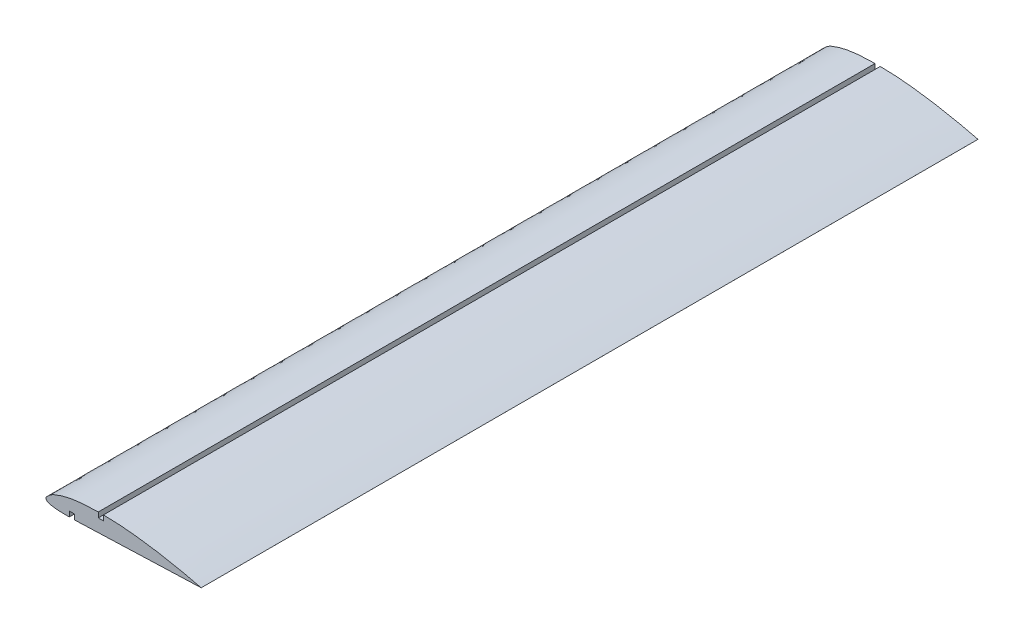
ISO-10303-21;
HEADER;
FILE_DESCRIPTION(('STEP AP214'),'2;1');
FILE_NAME('part.step','',(''),(''),'','','');
FILE_SCHEMA(('AUTOMOTIVE_DESIGN { 1 0 10303 214 1 1 1 1 }'));
ENDSEC;
DATA;
#1=APPLICATION_CONTEXT('core data for automotive mechanical design processes');
#2=APPLICATION_PROTOCOL_DEFINITION('international standard','automotive_design',2000,#1);
#3=PRODUCT_CONTEXT('',#1,'mechanical');
#4=PRODUCT('Part','Part','',(#3));
#5=PRODUCT_RELATED_PRODUCT_CATEGORY('part','',(#4));
#6=PRODUCT_DEFINITION_FORMATION('','',#4);
#7=PRODUCT_DEFINITION_CONTEXT('part definition',#1,'design');
#8=PRODUCT_DEFINITION('design','',#6,#7);
#9=PRODUCT_DEFINITION_SHAPE('','',#8);
#10=(LENGTH_UNIT() NAMED_UNIT(*) SI_UNIT(.MILLI.,.METRE.));
#11=(NAMED_UNIT(*) PLANE_ANGLE_UNIT() SI_UNIT($,.RADIAN.));
#12=(NAMED_UNIT(*) SI_UNIT($,.STERADIAN.) SOLID_ANGLE_UNIT());
#13=UNCERTAINTY_MEASURE_WITH_UNIT(LENGTH_MEASURE(1.E-05),#10,'distance_accuracy_value','');
#14=(GEOMETRIC_REPRESENTATION_CONTEXT(3) GLOBAL_UNCERTAINTY_ASSIGNED_CONTEXT((#13)) GLOBAL_UNIT_ASSIGNED_CONTEXT((#10,
#11,#12)) REPRESENTATION_CONTEXT('',''));
#15=CARTESIAN_POINT('',(0.,0.,0.));
#16=DIRECTION('',(0.,0.,1.));
#17=DIRECTION('',(1.,0.,0.));
#18=AXIS2_PLACEMENT_3D('',#15,#16,#17);
#19=CARTESIAN_POINT('',(149.858113324451,0.,750.));
#20=CARTESIAN_POINT('',(148.064864637399,0.471027480571199,750.));
#21=CARTESIAN_POINT('',(143.224769961219,1.74236211811161,750.));
#22=CARTESIAN_POINT('',(133.17567091378,3.88603462709681,750.));
#23=CARTESIAN_POINT('',(119.49949698937,6.75825321488289,750.));
#24=CARTESIAN_POINT('',(102.541429981933,9.74443836476265,750.));
#25=CARTESIAN_POINT('',(85.9645177190842,11.9562687917025,750.));
#26=CARTESIAN_POINT('',(70.8168434684203,13.3137751379511,750.));
#27=CARTESIAN_POINT('',(56.6678267857071,13.848112215604,750.));
#28=CARTESIAN_POINT('',(41.7647448709352,13.6427323871967,750.));
#29=CARTESIAN_POINT('',(27.8783013676399,12.538757837371,750.));
#30=CARTESIAN_POINT('',(17.5168627272865,10.350224421098,750.));
#31=CARTESIAN_POINT('',(10.936048165934,8.12119196566078,750.));
#32=CARTESIAN_POINT('',(5.62820626621041,6.01727904599079,750.));
#33=CARTESIAN_POINT('',(2.24075913813908,3.15994777527147,750.));
#34=CARTESIAN_POINT('',(-0.29369692166815,0.719700584099168,750.));
#35=CARTESIAN_POINT('',(0.542306534655351,-2.40076311543508,750.));
#36=CARTESIAN_POINT('',(4.95662502281578,-3.53766337211111,750.));
#37=CARTESIAN_POINT('',(10.612229446523,-4.32782494228123,750.));
#38=CARTESIAN_POINT('',(18.7708181091969,-4.49819941068066,750.));
#39=CARTESIAN_POINT('',(30.5005368269184,-4.49335985929626,750.));
#40=CARTESIAN_POINT('',(45.7844665479909,-3.91223480346035,750.));
#41=CARTESIAN_POINT('',(66.3707609860383,-3.12279025641842,750.));
#42=CARTESIAN_POINT('',(87.01625275022,-2.37810206356992,750.));
#43=CARTESIAN_POINT('',(108.487999192868,-1.57615015565665,750.));
#44=CARTESIAN_POINT('',(124.547177915777,-1.00276144849991,750.));
#45=CARTESIAN_POINT('',(137.784916861577,-0.52187684905939,750.));
#46=CARTESIAN_POINT('',(145.12231888116,-0.266429975668519,750.));
#47=CARTESIAN_POINT('',(148.916898874476,-0.0599947981625784,750.));
#48=CARTESIAN_POINT('',(149.855835651228,-0.00867132956302672,750.));
#49=B_SPLINE_CURVE_WITH_KNOTS('',3,(#19,#20,#21,#22,#23,#24,#25,#26,#27,#28,#29,#30,#31,#32,#33,
#34,#35,#36,#37,#38,#39,#40,#41,#42,#43,#44,#45,#46,#47,#48),.UNSPECIFIED.,.F.,.F.,(4,1,1,1,1,1,
1,1,1,1,1,1,1,1,1,1,1,1,1,1,1,1,1,1,1,1,1,4),(0.,0.0181631382577917,0.0490234920135145,
0.10064364459373,0.155079572876184,0.217678278972855,0.264435783533979,0.304025297713347,
0.35634535608504,0.410393024717116,0.440307190464658,0.459595640947688,0.478843318113965,
0.494821297559263,0.504998977671131,0.508601055765118,0.52425623472622,0.542615556539684,
0.567476747028401,0.602874088847224,0.658123072245803,0.717036036237965,0.804816302326953,
0.860486782816155,0.927555311002133,0.962250042652268,0.990268591499163,0.999481251844763),.UNSPECIFIED.);
#50=DIRECTION('',(0.,0.,-1.));
#51=VECTOR('',#50,1.);
#52=SURFACE_OF_LINEAR_EXTRUSION('',#49,#51);
#53=CARTESIAN_POINT('',(27.5042715696321,-4.45472738450817,750.));
#54=VERTEX_POINT('',#53);
#55=CARTESIAN_POINT('',(149.855835651228,-0.00867132956302675,750.));
#56=VERTEX_POINT('',#55);
#57=EDGE_CURVE('E179',#54,#56,#49,.T.);
#58=ORIENTED_EDGE('',*,*,#57,.F.);
#59=DIRECTION('',(0.,0.,-1.));
#60=VECTOR('',#59,1.);
#61=CARTESIAN_POINT('',(27.5042715696321,-4.45472738450817,750.));
#62=LINE('',#61,#60);
#63=CARTESIAN_POINT('',(27.5042715696321,-4.45472738450817,0.));
#64=VERTEX_POINT('',#63);
#65=EDGE_CURVE('E168',#54,#64,#62,.T.);
#66=ORIENTED_EDGE('',*,*,#65,.T.);
#67=CARTESIAN_POINT('',(149.858113324451,0.,0.));
#68=CARTESIAN_POINT('',(148.064864637399,0.471027480571199,0.));
#69=CARTESIAN_POINT('',(143.224769961219,1.74236211811161,0.));
#70=CARTESIAN_POINT('',(133.17567091378,3.88603462709681,0.));
#71=CARTESIAN_POINT('',(119.49949698937,6.75825321488289,0.));
#72=CARTESIAN_POINT('',(102.541429981933,9.74443836476265,0.));
#73=CARTESIAN_POINT('',(85.9645177190842,11.9562687917025,0.));
#74=CARTESIAN_POINT('',(70.8168434684203,13.3137751379511,0.));
#75=CARTESIAN_POINT('',(56.6678267857071,13.848112215604,0.));
#76=CARTESIAN_POINT('',(41.7647448709352,13.6427323871967,0.));
#77=CARTESIAN_POINT('',(27.8783013676399,12.538757837371,0.));
#78=CARTESIAN_POINT('',(17.5168627272865,10.350224421098,0.));
#79=CARTESIAN_POINT('',(10.936048165934,8.12119196566078,0.));
#80=CARTESIAN_POINT('',(5.62820626621041,6.01727904599079,0.));
#81=CARTESIAN_POINT('',(2.24075913813908,3.15994777527147,0.));
#82=CARTESIAN_POINT('',(-0.29369692166815,0.719700584099168,0.));
#83=CARTESIAN_POINT('',(0.542306534655351,-2.40076311543508,0.));
#84=CARTESIAN_POINT('',(4.95662502281578,-3.53766337211111,0.));
#85=CARTESIAN_POINT('',(10.612229446523,-4.32782494228123,0.));
#86=CARTESIAN_POINT('',(18.7708181091969,-4.49819941068066,0.));
#87=CARTESIAN_POINT('',(30.5005368269184,-4.49335985929626,0.));
#88=CARTESIAN_POINT('',(45.7844665479909,-3.91223480346035,0.));
#89=CARTESIAN_POINT('',(66.3707609860383,-3.12279025641842,0.));
#90=CARTESIAN_POINT('',(87.01625275022,-2.37810206356992,0.));
#91=CARTESIAN_POINT('',(108.487999192868,-1.57615015565665,0.));
#92=CARTESIAN_POINT('',(124.547177915777,-1.00276144849991,0.));
#93=CARTESIAN_POINT('',(137.784916861577,-0.52187684905939,0.));
#94=CARTESIAN_POINT('',(145.12231888116,-0.266429975668519,0.));
#95=CARTESIAN_POINT('',(148.916898874476,-0.0599947981625784,0.));
#96=CARTESIAN_POINT('',(149.855835651228,-0.00867132956302672,0.));
#97=B_SPLINE_CURVE_WITH_KNOTS('',3,(#67,#68,#69,#70,#71,#72,#73,#74,#75,#76,#77,#78,#79,#80,#81,
#82,#83,#84,#85,#86,#87,#88,#89,#90,#91,#92,#93,#94,#95,#96),.UNSPECIFIED.,.F.,.F.,(4,1,1,1,1,1,
1,1,1,1,1,1,1,1,1,1,1,1,1,1,1,1,1,1,1,1,1,4),(0.,0.0181631382577917,0.0490234920135145,
0.10064364459373,0.155079572876184,0.217678278972855,0.264435783533979,0.304025297713347,
0.35634535608504,0.410393024717116,0.440307190464658,0.459595640947688,0.478843318113965,
0.494821297559263,0.504998977671131,0.508601055765118,0.52425623472622,0.542615556539684,
0.567476747028401,0.602874088847224,0.658123072245803,0.717036036237965,0.804816302326953,
0.860486782816155,0.927555311002133,0.962250042652268,0.990268591499163,0.999481251844763),.UNSPECIFIED.);
#98=CARTESIAN_POINT('',(149.855835651228,-0.00867132956302675,0.));
#99=VERTEX_POINT('',#98);
#100=EDGE_CURVE('E170',#64,#99,#97,.T.);
#101=ORIENTED_EDGE('',*,*,#100,.T.);
#102=DIRECTION('',(0.,0.,-1.));
#103=VECTOR('',#102,1.);
#104=CARTESIAN_POINT('',(149.855835651228,-0.00867132956302675,750.));
#105=LINE('',#104,#103);
#106=EDGE_CURVE('E198',#56,#99,#105,.T.);
#107=ORIENTED_EDGE('',*,*,#106,.F.);
#108=EDGE_LOOP('',(#58,#66,#101,#107));
#109=FACE_BOUND('',#108,.T.);
#110=ADVANCED_FACE('F38',(#109),#52,.F.);
#111=CARTESIAN_POINT('',(50.4738305818708,13.7214936596193,0.));
#112=VERTEX_POINT('',#111);
#113=CARTESIAN_POINT('',(22.504271550368,-4.48413350364602,0.));
#114=VERTEX_POINT('',#113);
#115=EDGE_CURVE('E191',#112,#114,#97,.T.);
#116=ORIENTED_EDGE('',*,*,#115,.T.);
#117=DIRECTION('',(0.,0.,-1.));
#118=VECTOR('',#117,1.);
#119=CARTESIAN_POINT('',(22.5042715696321,-4.48413350365689,750.));
#120=LINE('',#119,#118);
#121=CARTESIAN_POINT('',(22.5042715696321,-4.48413350364602,750.));
#122=VERTEX_POINT('',#121);
#123=EDGE_CURVE('E53',#114,#122,#120,.F.);
#124=ORIENTED_EDGE('',*,*,#123,.T.);
#125=CARTESIAN_POINT('',(50.4738305818708,13.7214936596193,750.));
#126=VERTEX_POINT('',#125);
#127=EDGE_CURVE('E178',#126,#122,#49,.T.);
#128=ORIENTED_EDGE('',*,*,#127,.F.);
#129=DIRECTION('',(0.,0.,-1.));
#130=VECTOR('',#129,1.);
#131=CARTESIAN_POINT('',(50.4738305818708,13.7214936596193,750.));
#132=LINE('',#131,#130);
#133=EDGE_CURVE('E158',#126,#112,#132,.T.);
#134=ORIENTED_EDGE('',*,*,#133,.T.);
#135=EDGE_LOOP('',(#116,#124,#128,#134));
#136=FACE_BOUND('',#135,.T.);
#137=ADVANCED_FACE('F223',(#136),#52,.F.);
#138=CARTESIAN_POINT('',(149.858113324451,0.,0.));
#139=VERTEX_POINT('',#138);
#140=CARTESIAN_POINT('',(55.4738305818709,13.7366739658769,0.));
#141=VERTEX_POINT('',#140);
#142=EDGE_CURVE('E185',#139,#141,#97,.T.);
#143=ORIENTED_EDGE('',*,*,#142,.T.);
#144=DIRECTION('',(0.,0.,-1.));
#145=VECTOR('',#144,1.);
#146=CARTESIAN_POINT('',(55.4738305818708,13.7366739658769,750.));
#147=LINE('',#146,#145);
#148=CARTESIAN_POINT('',(55.4738305818708,13.7366739658769,750.));
#149=VERTEX_POINT('',#148);
#150=EDGE_CURVE('E61',#141,#149,#147,.F.);
#151=ORIENTED_EDGE('',*,*,#150,.T.);
#152=CARTESIAN_POINT('',(149.858113324451,0.,750.));
#153=VERTEX_POINT('',#152);
#154=EDGE_CURVE('E171',#153,#149,#49,.T.);
#155=ORIENTED_EDGE('',*,*,#154,.F.);
#156=DIRECTION('',(0.,0.,-1.));
#157=VECTOR('',#156,1.);
#158=CARTESIAN_POINT('',(149.858113324451,0.,750.));
#159=LINE('',#158,#157);
#160=EDGE_CURVE('E184',#153,#139,#159,.T.);
#161=ORIENTED_EDGE('',*,*,#160,.T.);
#162=EDGE_LOOP('',(#143,#151,#155,#161));
#163=FACE_BOUND('',#162,.T.);
#164=ADVANCED_FACE('F40',(#163),#52,.F.);
#165=CARTESIAN_POINT('',(149.858113324451,0.,750.));
#166=DIRECTION('',(-0.967191257388956,0.254049348809183,0.));
#167=DIRECTION('',(-0.254049348809183,-0.967191257388956,0.));
#168=AXIS2_PLACEMENT_3D('',#165,#166,#167);
#169=PLANE('',#168);
#170=DIRECTION('',(0.254049348809183,0.967191257388956,0.));
#171=VECTOR('',#170,1.);
#172=CARTESIAN_POINT('',(149.858113324451,0.,0.));
#173=LINE('',#172,#171);
#174=EDGE_CURVE('E190',#99,#139,#173,.T.);
#175=ORIENTED_EDGE('',*,*,#174,.T.);
#176=ORIENTED_EDGE('',*,*,#160,.F.);
#177=DIRECTION('',(0.254049348809183,0.967191257388956,0.));
#178=VECTOR('',#177,1.);
#179=CARTESIAN_POINT('',(149.858113324451,0.,750.));
#180=LINE('',#179,#178);
#181=EDGE_CURVE('E177',#56,#153,#180,.T.);
#182=ORIENTED_EDGE('',*,*,#181,.F.);
#183=ORIENTED_EDGE('',*,*,#106,.T.);
#184=EDGE_LOOP('',(#175,#176,#182,#183));
#185=FACE_BOUND('',#184,.T.);
#186=ADVANCED_FACE('F219',(#185),#169,.F.);
#187=CARTESIAN_POINT('',(0.580452880039153,1.44329470279021,750.));
#188=DIRECTION('',(0.,0.,-1.));
#189=DIRECTION('',(-1.,0.,0.));
#190=AXIS2_PLACEMENT_3D('',#187,#188,#189);
#191=PLANE('',#190);
#192=DIRECTION('',(1.,0.,0.));
#193=VECTOR('',#192,1.);
#194=CARTESIAN_POINT('',(0.580452880039153,0.545272615491838,750.));
#195=LINE('',#194,#193);
#196=CARTESIAN_POINT('',(22.5042715696321,0.545272615491835,750.));
#197=VERTEX_POINT('',#196);
#198=CARTESIAN_POINT('',(27.5042715696321,0.545272615491835,750.));
#199=VERTEX_POINT('',#198);
#200=EDGE_CURVE('E124',#197,#199,#195,.T.);
#201=ORIENTED_EDGE('',*,*,#200,.T.);
#202=DIRECTION('',(0.,-1.,0.));
#203=VECTOR('',#202,1.);
#204=CARTESIAN_POINT('',(27.5042715696321,1.44329470279021,750.));
#205=LINE('',#204,#203);
#206=EDGE_CURVE('E165',#199,#54,#205,.T.);
#207=ORIENTED_EDGE('',*,*,#206,.T.);
#208=ORIENTED_EDGE('',*,*,#57,.T.);
#209=ORIENTED_EDGE('',*,*,#181,.T.);
#210=ORIENTED_EDGE('',*,*,#154,.T.);
#211=DIRECTION('',(0.,-1.,0.));
#212=VECTOR('',#211,1.);
#213=CARTESIAN_POINT('',(55.4738305818708,1.44329470279037,750.));
#214=LINE('',#213,#212);
#215=CARTESIAN_POINT('',(55.4738305818708,8.72149365961927,750.));
#216=VERTEX_POINT('',#215);
#217=EDGE_CURVE('E141',#149,#216,#214,.T.);
#218=ORIENTED_EDGE('',*,*,#217,.T.);
#219=DIRECTION('',(-1.,0.,0.));
#220=VECTOR('',#219,1.);
#221=CARTESIAN_POINT('',(0.580452880039153,8.72149365961927,750.));
#222=LINE('',#221,#220);
#223=CARTESIAN_POINT('',(50.4738305818708,8.72149365961927,750.));
#224=VERTEX_POINT('',#223);
#225=EDGE_CURVE('E152',#216,#224,#222,.T.);
#226=ORIENTED_EDGE('',*,*,#225,.T.);
#227=DIRECTION('',(0.,1.,0.));
#228=VECTOR('',#227,1.);
#229=CARTESIAN_POINT('',(50.4738305818708,1.44329470279021,750.));
#230=LINE('',#229,#228);
#231=EDGE_CURVE('E155',#224,#126,#230,.T.);
#232=ORIENTED_EDGE('',*,*,#231,.T.);
#233=ORIENTED_EDGE('',*,*,#127,.T.);
#234=DIRECTION('',(0.,1.,0.));
#235=VECTOR('',#234,1.);
#236=CARTESIAN_POINT('',(22.5042715696321,1.44329470279026,750.));
#237=LINE('',#236,#235);
#238=EDGE_CURVE('E161',#122,#197,#237,.T.);
#239=ORIENTED_EDGE('',*,*,#238,.T.);
#240=EDGE_LOOP('',(#201,#207,#208,#209,#210,#218,#226,#232,#233,#239));
#241=FACE_BOUND('',#240,.T.);
#242=ADVANCED_FACE('F209',(#241),#191,.F.);
#243=CARTESIAN_POINT('',(0.580452880039153,1.44329470279021,0.));
#244=DIRECTION('',(0.,0.,-1.));
#245=DIRECTION('',(-1.,0.,0.));
#246=AXIS2_PLACEMENT_3D('',#243,#244,#245);
#247=PLANE('',#246);
#248=DIRECTION('',(0.,-1.,0.));
#249=VECTOR('',#248,1.);
#250=CARTESIAN_POINT('',(27.5042715696321,-6.85372053696798,0.));
#251=LINE('',#250,#249);
#252=CARTESIAN_POINT('',(27.5042715696321,0.545272615491835,0.));
#253=VERTEX_POINT('',#252);
#254=EDGE_CURVE('E127',#253,#64,#251,.T.);
#255=ORIENTED_EDGE('',*,*,#254,.F.);
#256=DIRECTION('',(1.,0.,0.));
#257=VECTOR('',#256,1.);
#258=CARTESIAN_POINT('',(22.5042715696321,0.545272615491835,0.));
#259=LINE('',#258,#257);
#260=CARTESIAN_POINT('',(22.5042715696321,0.545272615491835,0.));
#261=VERTEX_POINT('',#260);
#262=EDGE_CURVE('E121',#261,#253,#259,.T.);
#263=ORIENTED_EDGE('',*,*,#262,.F.);
#264=DIRECTION('',(0.,1.,0.));
#265=VECTOR('',#264,1.);
#266=CARTESIAN_POINT('',(22.5042715696321,1.44329470279026,0.));
#267=LINE('',#266,#265);
#268=EDGE_CURVE('E11',#114,#261,#267,.T.);
#269=ORIENTED_EDGE('',*,*,#268,.F.);
#270=ORIENTED_EDGE('',*,*,#115,.F.);
#271=DIRECTION('',(0.,1.,0.));
#272=VECTOR('',#271,1.);
#273=CARTESIAN_POINT('',(50.4738305818708,13.7214936596193,0.));
#274=LINE('',#273,#272);
#275=CARTESIAN_POINT('',(50.4738305818708,8.72149365961927,0.));
#276=VERTEX_POINT('',#275);
#277=EDGE_CURVE('E146',#276,#112,#274,.T.);
#278=ORIENTED_EDGE('',*,*,#277,.F.);
#279=DIRECTION('',(-1.,0.,0.));
#280=VECTOR('',#279,1.);
#281=CARTESIAN_POINT('',(50.4738305818708,8.72149365961927,0.));
#282=LINE('',#281,#280);
#283=CARTESIAN_POINT('',(55.4738305818708,8.72149365961927,0.));
#284=VERTEX_POINT('',#283);
#285=EDGE_CURVE('E143',#284,#276,#282,.T.);
#286=ORIENTED_EDGE('',*,*,#285,.F.);
#287=DIRECTION('',(0.,-1.,0.));
#288=VECTOR('',#287,1.);
#289=CARTESIAN_POINT('',(55.4738305818708,1.44329470279037,0.));
#290=LINE('',#289,#288);
#291=EDGE_CURVE('E47',#141,#284,#290,.T.);
#292=ORIENTED_EDGE('',*,*,#291,.F.);
#293=ORIENTED_EDGE('',*,*,#142,.F.);
#294=ORIENTED_EDGE('',*,*,#174,.F.);
#295=ORIENTED_EDGE('',*,*,#100,.F.);
#296=EDGE_LOOP('',(#255,#263,#269,#270,#278,#286,#292,#293,#294,#295));
#297=FACE_BOUND('',#296,.T.);
#298=ADVANCED_FACE('F133',(#297),#247,.T.);
#299=CARTESIAN_POINT('',(50.4738305818708,13.7214936596193,792.));
#300=DIRECTION('',(-1.,0.,0.));
#301=DIRECTION('',(0.,0.,1.));
#302=AXIS2_PLACEMENT_3D('',#299,#300,#301);
#303=PLANE('',#302);
#304=ORIENTED_EDGE('',*,*,#231,.F.);
#305=DIRECTION('',(0.,0.,-1.));
#306=VECTOR('',#305,1.);
#307=CARTESIAN_POINT('',(50.4738305818708,8.72149365961927,792.));
#308=LINE('',#307,#306);
#309=EDGE_CURVE('E135',#224,#276,#308,.T.);
#310=ORIENTED_EDGE('',*,*,#309,.T.);
#311=ORIENTED_EDGE('',*,*,#277,.T.);
#312=ORIENTED_EDGE('',*,*,#133,.F.);
#313=EDGE_LOOP('',(#304,#310,#311,#312));
#314=FACE_BOUND('',#313,.T.);
#315=ADVANCED_FACE('F225',(#314),#303,.F.);
#316=CARTESIAN_POINT('',(50.4738305818708,8.72149365961927,792.));
#317=DIRECTION('',(0.,-1.,0.));
#318=DIRECTION('',(0.,0.,-1.));
#319=AXIS2_PLACEMENT_3D('',#316,#317,#318);
#320=PLANE('',#319);
#321=DIRECTION('',(0.,0.,-1.));
#322=VECTOR('',#321,1.);
#323=CARTESIAN_POINT('',(55.4738305818708,8.72149365961927,792.));
#324=LINE('',#323,#322);
#325=EDGE_CURVE('E138',#216,#284,#324,.T.);
#326=ORIENTED_EDGE('',*,*,#325,.T.);
#327=ORIENTED_EDGE('',*,*,#285,.T.);
#328=ORIENTED_EDGE('',*,*,#309,.F.);
#329=ORIENTED_EDGE('',*,*,#225,.F.);
#330=EDGE_LOOP('',(#326,#327,#328,#329));
#331=FACE_BOUND('',#330,.T.);
#332=ADVANCED_FACE('F207',(#331),#320,.F.);
#333=CARTESIAN_POINT('',(55.4738305818708,8.72149365961927,792.));
#334=DIRECTION('',(1.,0.,0.));
#335=DIRECTION('',(0.,1.,0.));
#336=AXIS2_PLACEMENT_3D('',#333,#334,#335);
#337=PLANE('',#336);
#338=ORIENTED_EDGE('',*,*,#291,.T.);
#339=ORIENTED_EDGE('',*,*,#325,.F.);
#340=ORIENTED_EDGE('',*,*,#217,.F.);
#341=ORIENTED_EDGE('',*,*,#150,.F.);
#342=EDGE_LOOP('',(#338,#339,#340,#341));
#343=FACE_BOUND('',#342,.T.);
#344=ADVANCED_FACE('F202',(#343),#337,.F.);
#345=CARTESIAN_POINT('',(27.5042715696321,-6.85372053696798,792.));
#346=DIRECTION('',(1.,0.,0.));
#347=DIRECTION('',(0.,0.,-1.));
#348=AXIS2_PLACEMENT_3D('',#345,#346,#347);
#349=PLANE('',#348);
#350=ORIENTED_EDGE('',*,*,#206,.F.);
#351=DIRECTION('',(0.,0.,-1.));
#352=VECTOR('',#351,1.);
#353=CARTESIAN_POINT('',(27.5042715696321,0.545272615491835,792.));
#354=LINE('',#353,#352);
#355=EDGE_CURVE('E126',#199,#253,#354,.T.);
#356=ORIENTED_EDGE('',*,*,#355,.T.);
#357=ORIENTED_EDGE('',*,*,#254,.T.);
#358=ORIENTED_EDGE('',*,*,#65,.F.);
#359=EDGE_LOOP('',(#350,#356,#357,#358));
#360=FACE_BOUND('',#359,.T.);
#361=ADVANCED_FACE('F249',(#360),#349,.F.);
#362=CARTESIAN_POINT('',(22.5042715696321,0.545272615491835,792.));
#363=DIRECTION('',(0.,1.,0.));
#364=DIRECTION('',(-1.,0.,0.));
#365=AXIS2_PLACEMENT_3D('',#362,#363,#364);
#366=PLANE('',#365);
#367=DIRECTION('',(0.,0.,-1.));
#368=VECTOR('',#367,1.);
#369=CARTESIAN_POINT('',(22.5042715696321,0.545272615491835,792.));
#370=LINE('',#369,#368);
#371=EDGE_CURVE('E117',#197,#261,#370,.T.);
#372=ORIENTED_EDGE('',*,*,#371,.T.);
#373=ORIENTED_EDGE('',*,*,#262,.T.);
#374=ORIENTED_EDGE('',*,*,#355,.F.);
#375=ORIENTED_EDGE('',*,*,#200,.F.);
#376=EDGE_LOOP('',(#372,#373,#374,#375));
#377=FACE_BOUND('',#376,.T.);
#378=ADVANCED_FACE('F118',(#377),#366,.F.);
#379=CARTESIAN_POINT('',(22.5042715696321,-4.48413350365689,792.));
#380=DIRECTION('',(-1.,0.,0.));
#381=DIRECTION('',(0.,-1.,0.));
#382=AXIS2_PLACEMENT_3D('',#379,#380,#381);
#383=PLANE('',#382);
#384=ORIENTED_EDGE('',*,*,#268,.T.);
#385=ORIENTED_EDGE('',*,*,#371,.F.);
#386=ORIENTED_EDGE('',*,*,#238,.F.);
#387=ORIENTED_EDGE('',*,*,#123,.F.);
#388=EDGE_LOOP('',(#384,#385,#386,#387));
#389=FACE_BOUND('',#388,.T.);
#390=ADVANCED_FACE('F129',(#389),#383,.F.);
#391=CLOSED_SHELL('',(#110,#137,#164,#186,#242,#298,#315,#332,#344,#361,#378,#390));
#392=MANIFOLD_SOLID_BREP('B2',#391);
#393=ADVANCED_BREP_SHAPE_REPRESENTATION('',(#18,#392),#14);
#394=SHAPE_DEFINITION_REPRESENTATION(#9,#393);
ENDSEC;
END-ISO-10303-21;
